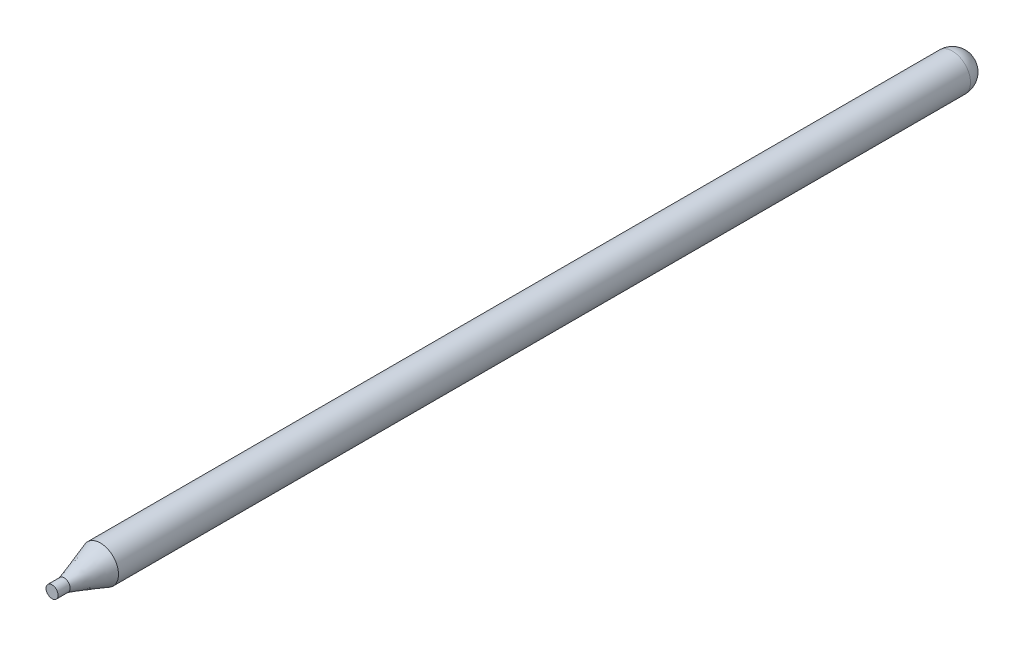
ISO-10303-21;
HEADER;
FILE_DESCRIPTION(('STEP AP214'),'2;1');
FILE_NAME('part.step','',(''),(''),'','','');
FILE_SCHEMA(('AUTOMOTIVE_DESIGN { 1 0 10303 214 1 1 1 1 }'));
ENDSEC;
DATA;
#1=APPLICATION_CONTEXT('core data for automotive mechanical design processes');
#2=APPLICATION_PROTOCOL_DEFINITION('international standard','automotive_design',2000,#1);
#3=PRODUCT_CONTEXT('',#1,'mechanical');
#4=PRODUCT('Part','Part','',(#3));
#5=PRODUCT_RELATED_PRODUCT_CATEGORY('part','',(#4));
#6=PRODUCT_DEFINITION_FORMATION('','',#4);
#7=PRODUCT_DEFINITION_CONTEXT('part definition',#1,'design');
#8=PRODUCT_DEFINITION('design','',#6,#7);
#9=PRODUCT_DEFINITION_SHAPE('','',#8);
#10=(LENGTH_UNIT() NAMED_UNIT(*) SI_UNIT(.MILLI.,.METRE.));
#11=(NAMED_UNIT(*) PLANE_ANGLE_UNIT() SI_UNIT($,.RADIAN.));
#12=(NAMED_UNIT(*) SI_UNIT($,.STERADIAN.) SOLID_ANGLE_UNIT());
#13=UNCERTAINTY_MEASURE_WITH_UNIT(LENGTH_MEASURE(1.E-05),#10,'distance_accuracy_value','');
#14=(GEOMETRIC_REPRESENTATION_CONTEXT(3) GLOBAL_UNCERTAINTY_ASSIGNED_CONTEXT((#13)) GLOBAL_UNIT_ASSIGNED_CONTEXT((#10,
#11,#12)) REPRESENTATION_CONTEXT('',''));
#15=CARTESIAN_POINT('',(0.,0.,0.));
#16=DIRECTION('',(0.,0.,1.));
#17=DIRECTION('',(1.,0.,0.));
#18=AXIS2_PLACEMENT_3D('',#15,#16,#17);
#19=CARTESIAN_POINT('',(0.,0.,144.));
#20=DIRECTION('',(0.,0.,-1.));
#21=DIRECTION('',(-1.,0.,0.));
#22=AXIS2_PLACEMENT_3D('',#19,#20,#21);
#23=CYLINDRICAL_SURFACE('',#22,3.);
#24=CARTESIAN_POINT('',(0.,0.,3.));
#25=DIRECTION('',(0.,0.,-1.));
#26=DIRECTION('',(-1.,0.,0.));
#27=AXIS2_PLACEMENT_3D('',#24,#25,#26);
#28=CIRCLE('',#27,3.);
#29=CARTESIAN_POINT('',(-3.,0.,3.));
#30=VERTEX_POINT('',#29);
#31=EDGE_CURVE('E11',#30,#30,#28,.F.);
#32=ORIENTED_EDGE('',*,*,#31,.T.);
#33=EDGE_LOOP('',(#32));
#34=FACE_BOUND('',#33,.T.);
#35=CARTESIAN_POINT('',(0.,0.,144.));
#36=DIRECTION('',(0.,0.,-1.));
#37=DIRECTION('',(-1.,0.,0.));
#38=AXIS2_PLACEMENT_3D('',#35,#36,#37);
#39=CIRCLE('',#38,3.);
#40=CARTESIAN_POINT('',(-1.18105566968107,2.75773593824974,144.));
#41=VERTEX_POINT('',#40);
#42=EDGE_CURVE('E52',#41,#41,#39,.F.);
#43=ORIENTED_EDGE('',*,*,#42,.F.);
#44=EDGE_LOOP('',(#43));
#45=FACE_BOUND('',#44,.T.);
#46=ADVANCED_FACE('F43',(#34,#45),#23,.T.);
#47=CARTESIAN_POINT('',(0.,0.,3.));
#48=DIRECTION('',(0.,0.,1.));
#49=DIRECTION('',(1.,0.,0.));
#50=AXIS2_PLACEMENT_3D('',#47,#48,#49);
#51=SPHERICAL_SURFACE('',#50,3.);
#52=ORIENTED_EDGE('',*,*,#31,.F.);
#53=EDGE_LOOP('',(#52));
#54=FACE_BOUND('',#53,.T.);
#55=ADVANCED_FACE('F45',(#54),#51,.T.);
#56=CARTESIAN_POINT('',(-0.0492680615870097,0.998785591659921,150.));
#57=CARTESIAN_POINT('',(-1.18105566968107,2.75773593824974,144.));
#58=CARTESIAN_POINT('',(1.94830312173283,1.09732171483394,150.));
#59=CARTESIAN_POINT('',(4.33441620681842,5.11984727761189,144.));
#60=CARTESIAN_POINT('',(2.04683924490685,-0.900249468485902,150.));
#61=CARTESIAN_POINT('',(6.69652754618056,-0.395624598887602,144.));
#62=CARTESIAN_POINT('',(0.0492680615870096,-0.998785591659921,150.));
#63=CARTESIAN_POINT('',(1.18105566968107,-2.75773593824974,144.));
#64=CARTESIAN_POINT('',(-1.94830312173283,-1.09732171483394,150.));
#65=CARTESIAN_POINT('',(-4.33441620681842,-5.11984727761188,144.));
#66=CARTESIAN_POINT('',(-2.04683924490685,0.900249468485902,150.));
#67=CARTESIAN_POINT('',(-6.69652754618056,0.395624598887602,144.));
#68=CARTESIAN_POINT('',(-0.0492680615870097,0.998785591659921,150.));
#69=CARTESIAN_POINT('',(-1.18105566968107,2.75773593824974,144.));
#70=(BOUNDED_SURFACE() B_SPLINE_SURFACE(3,1,((#56,#57),(#58,#59),(#60,#61),(#62,#63),(#64,#65),
(#66,#67),(#68,#69)),.UNSPECIFIED.,.T.,.F.,.F.) B_SPLINE_SURFACE_WITH_KNOTS((4,3,4),(2,2),(0.,
0.5,1.),(0.,1.),.UNSPECIFIED.) GEOMETRIC_REPRESENTATION_ITEM() RATIONAL_B_SPLINE_SURFACE(((1.,
1.),(0.333333333333333,0.333333333333333),(0.333333333333333,0.333333333333333),(1.,1.),
(0.333333333333333,0.333333333333333),(0.333333333333333,0.333333333333333),(1.,1.))) REPRESENTATION_ITEM('') SURFACE());
#71=CARTESIAN_POINT('',(0.,0.,150.));
#72=DIRECTION('',(0.,0.,1.));
#73=DIRECTION('',(1.,0.,0.));
#74=AXIS2_PLACEMENT_3D('',#71,#72,#73);
#75=CIRCLE('',#74,1.);
#76=CARTESIAN_POINT('',(-0.0492680615870097,0.998785591659921,150.));
#77=VERTEX_POINT('',#76);
#78=EDGE_CURVE('E60',#77,#77,#75,.T.);
#79=CARTESIAN_POINT('',(-0.0492680615870097,0.998785591659921,150.));
#80=CARTESIAN_POINT('',(-0.0610575158379872,1.01710799110356,149.9375));
#81=CARTESIAN_POINT('',(-0.0728469700889678,1.03543039054721,149.875));
#82=CARTESIAN_POINT('',(-0.0964258785909289,1.0720751894345,149.75));
#83=CARTESIAN_POINT('',(-0.108215332841909,1.09039758887814,149.6875));
#84=CARTESIAN_POINT('',(-0.131794241343869,1.12704238776543,149.5625));
#85=CARTESIAN_POINT('',(-0.143583695594848,1.14536478720907,149.5));
#86=CARTESIAN_POINT('',(-0.167162604096807,1.18200958609636,149.375));
#87=CARTESIAN_POINT('',(-0.178952058347787,1.20033198554,149.3125));
#88=CARTESIAN_POINT('',(-0.202530966849747,1.23697678442729,149.1875));
#89=CARTESIAN_POINT('',(-0.214320421100727,1.25529918387094,149.125));
#90=CARTESIAN_POINT('',(-0.237899329602686,1.29194398275822,149.));
#91=CARTESIAN_POINT('',(-0.249688783853665,1.31026638220187,148.9375));
#92=CARTESIAN_POINT('',(-0.273267692355625,1.34691118108916,148.8125));
#93=CARTESIAN_POINT('',(-0.285057146606606,1.3652335805328,148.75));
#94=CARTESIAN_POINT('',(-0.308636055108566,1.40187837942009,148.625));
#95=CARTESIAN_POINT('',(-0.320425509359546,1.42020077886373,148.5625));
#96=CARTESIAN_POINT('',(-0.344004417861504,1.45684557775102,148.4375));
#97=CARTESIAN_POINT('',(-0.355793872112484,1.47516797719466,148.375));
#98=CARTESIAN_POINT('',(-0.379372780614444,1.51181277608195,148.25));
#99=CARTESIAN_POINT('',(-0.391162234865425,1.5301351755256,148.1875));
#100=CARTESIAN_POINT('',(-0.414741143367385,1.56677997441289,148.0625));
#101=CARTESIAN_POINT('',(-0.426530597618364,1.58510237385653,148.));
#102=CARTESIAN_POINT('',(-0.450109506120323,1.62174717274382,147.875));
#103=CARTESIAN_POINT('',(-0.461898960371303,1.64006957218746,147.8125));
#104=CARTESIAN_POINT('',(-0.485477868873262,1.67671437107475,147.6875));
#105=CARTESIAN_POINT('',(-0.497267323124242,1.69503677051839,147.625));
#106=CARTESIAN_POINT('',(-0.520846231626202,1.73168156940568,147.5));
#107=CARTESIAN_POINT('',(-0.532635685877182,1.75000396884932,147.4375));
#108=CARTESIAN_POINT('',(-0.556214594379141,1.78664876773661,147.3125));
#109=CARTESIAN_POINT('',(-0.56800404863012,1.80497116718026,147.25));
#110=CARTESIAN_POINT('',(-0.59158295713208,1.84161596606754,147.125));
#111=CARTESIAN_POINT('',(-0.60337241138306,1.85993836551119,147.0625));
#112=CARTESIAN_POINT('',(-0.626951319885021,1.89658316439848,146.9375));
#113=CARTESIAN_POINT('',(-0.638740774136001,1.91490556384212,146.875));
#114=CARTESIAN_POINT('',(-0.66231968263796,1.95155036272941,146.75));
#115=CARTESIAN_POINT('',(-0.674109136888939,1.96987276217305,146.6875));
#116=CARTESIAN_POINT('',(-0.697688045390899,2.00651756106034,146.5625));
#117=CARTESIAN_POINT('',(-0.709477499641879,2.02483996050398,146.5));
#118=CARTESIAN_POINT('',(-0.733056408143838,2.06148475939127,146.375));
#119=CARTESIAN_POINT('',(-0.744845862394818,2.07980715883492,146.3125));
#120=CARTESIAN_POINT('',(-0.768424770896778,2.1164519577222,146.1875));
#121=CARTESIAN_POINT('',(-0.780214225147758,2.13477435716585,146.125));
#122=CARTESIAN_POINT('',(-0.803793133649717,2.17141915605314,146.));
#123=CARTESIAN_POINT('',(-0.815582587900696,2.18974155549678,145.9375));
#124=CARTESIAN_POINT('',(-0.839161496402656,2.22638635438407,145.8125));
#125=CARTESIAN_POINT('',(-0.850950950653637,2.24470875382771,145.75));
#126=CARTESIAN_POINT('',(-0.874529859155597,2.281353552715,145.625));
#127=CARTESIAN_POINT('',(-0.886319313406576,2.29967595215864,145.5625));
#128=CARTESIAN_POINT('',(-0.909898221908535,2.33632075104593,145.4375));
#129=CARTESIAN_POINT('',(-0.921687676159514,2.35464315048957,145.375));
#130=CARTESIAN_POINT('',(-0.945266584661474,2.39128794937686,145.25));
#131=CARTESIAN_POINT('',(-0.957056038912455,2.40961034882051,145.1875));
#132=CARTESIAN_POINT('',(-0.980634947414415,2.4462551477078,145.0625));
#133=CARTESIAN_POINT('',(-0.992424401665394,2.46457754715144,145.));
#134=CARTESIAN_POINT('',(-1.01600331016735,2.50122234603873,144.875));
#135=CARTESIAN_POINT('',(-1.02779276441833,2.51954474548237,144.8125));
#136=CARTESIAN_POINT('',(-1.05137167292029,2.55618954436966,144.6875));
#137=CARTESIAN_POINT('',(-1.06316112717127,2.5745119438133,144.625));
#138=CARTESIAN_POINT('',(-1.08674003567323,2.61115674270059,144.5));
#139=CARTESIAN_POINT('',(-1.09852948992421,2.62947914214423,144.4375));
#140=CARTESIAN_POINT('',(-1.12210839842617,2.66612394103152,144.3125));
#141=CARTESIAN_POINT('',(-1.13389785267715,2.68444634047517,144.25));
#142=CARTESIAN_POINT('',(-1.15747676117911,2.72109113936246,144.125));
#143=CARTESIAN_POINT('',(-1.16926621543009,2.7394135388061,144.0625));
#144=CARTESIAN_POINT('',(-1.18105566968107,2.75773593824974,144.));
#145=B_SPLINE_CURVE_WITH_KNOTS('',3,(#79,#80,#81,#82,#83,#84,#85,#86,#87,#88,#89,#90,#91,#92,
#93,#94,#95,#96,#97,#98,#99,#100,#101,#102,#103,#104,#105,#106,#107,#108,#109,#110,#111,#112,
#113,#114,#115,#116,#117,#118,#119,#120,#121,#122,#123,#124,#125,#126,#127,#128,#129,#130,#131,
#132,#133,#134,#135,#136,#137,#138,#139,#140,#141,#142,#143,#144),.UNSPECIFIED.,.F.,.F.,(4,2,2,
2,2,2,2,2,2,2,2,2,2,2,2,2,2,2,2,2,2,2,2,2,2,2,2,2,2,2,2,2,4),(0.,0.198566270993284,
0.397132541986541,0.595698812979825,0.794265083973109,0.992831354966392,1.19139762595968,
1.38996389695293,1.58853016794622,1.7870964389395,1.98566270993276,2.18422898092604,
2.38279525191933,2.58136152291261,2.77992779390589,2.97849406489918,3.17706033589243,
3.37562660688569,3.57419287787898,3.77275914887226,3.97132541986554,4.16989169085883,
4.36845796185211,4.56702423284537,4.76559050383865,4.96415677483194,5.16272304582519,
5.36128931681848,5.55985558781176,5.75842185880505,5.95698812979833,6.15555440079159,
6.35412067178487),.UNSPECIFIED.);
#146=EDGE_CURVE('BSEAM87',#77,#41,#145,.T.);
#147=ORIENTED_EDGE('',*,*,#78,.F.);
#148=ORIENTED_EDGE('',*,*,#42,.T.);
#149=ORIENTED_EDGE('',*,*,#146,.T.);
#150=ORIENTED_EDGE('',*,*,#146,.F.);
#151=EDGE_LOOP('',(#147,#149,#148,#150));
#152=FACE_BOUND('',#151,.T.);
#153=ADVANCED_FACE('F87',(#152),#70,.T.);
#154=CARTESIAN_POINT('',(0.,0.,152.));
#155=DIRECTION('',(0.,0.,-1.));
#156=DIRECTION('',(-1.,0.,0.));
#157=AXIS2_PLACEMENT_3D('',#154,#155,#156);
#158=CYLINDRICAL_SURFACE('',#157,1.);
#159=CARTESIAN_POINT('',(0.,0.,152.));
#160=DIRECTION('',(0.,0.,1.));
#161=DIRECTION('',(1.,0.,0.));
#162=AXIS2_PLACEMENT_3D('',#159,#160,#161);
#163=CIRCLE('',#162,1.);
#164=CARTESIAN_POINT('',(1.,0.,152.));
#165=VERTEX_POINT('',#164);
#166=EDGE_CURVE('E149',#165,#165,#163,.T.);
#167=ORIENTED_EDGE('',*,*,#166,.F.);
#168=EDGE_LOOP('',(#167));
#169=FACE_BOUND('',#168,.T.);
#170=ORIENTED_EDGE('',*,*,#78,.T.);
#171=EDGE_LOOP('',(#170));
#172=FACE_BOUND('',#171,.T.);
#173=ADVANCED_FACE('F77',(#169,#172),#158,.T.);
#174=CARTESIAN_POINT('',(0.,0.,152.));
#175=DIRECTION('',(0.,0.,1.));
#176=DIRECTION('',(1.,0.,0.));
#177=AXIS2_PLACEMENT_3D('',#174,#175,#176);
#178=PLANE('',#177);
#179=ORIENTED_EDGE('',*,*,#166,.T.);
#180=EDGE_LOOP('',(#179));
#181=FACE_BOUND('',#180,.T.);
#182=ADVANCED_FACE('F86',(#181),#178,.T.);
#183=CLOSED_SHELL('',(#46,#55,#153,#173,#182));
#184=MANIFOLD_SOLID_BREP('B2',#183);
#185=ADVANCED_BREP_SHAPE_REPRESENTATION('',(#18,#184),#14);
#186=SHAPE_DEFINITION_REPRESENTATION(#9,#185);
ENDSEC;
END-ISO-10303-21;
